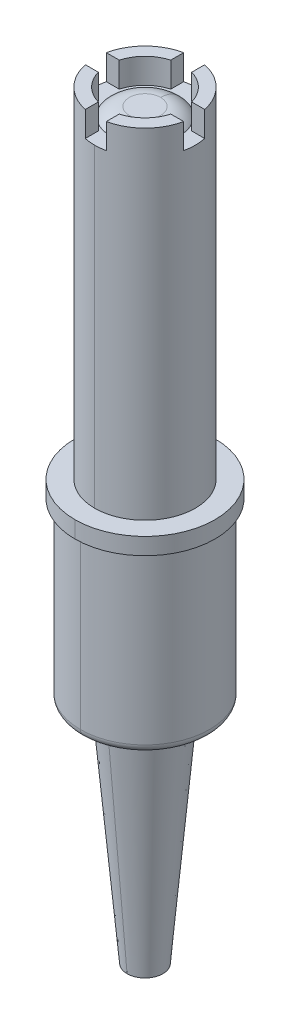
ISO-10303-21;
HEADER;
FILE_DESCRIPTION(('STEP AP214'),'2;1');
FILE_NAME('part.step','',(''),(''),'','','');
FILE_SCHEMA(('AUTOMOTIVE_DESIGN { 1 0 10303 214 1 1 1 1 }'));
ENDSEC;
DATA;
#1=APPLICATION_CONTEXT('core data for automotive mechanical design processes');
#2=APPLICATION_PROTOCOL_DEFINITION('international standard','automotive_design',2000,#1);
#3=PRODUCT_CONTEXT('',#1,'mechanical');
#4=PRODUCT('Part','Part','',(#3));
#5=PRODUCT_RELATED_PRODUCT_CATEGORY('part','',(#4));
#6=PRODUCT_DEFINITION_FORMATION('','',#4);
#7=PRODUCT_DEFINITION_CONTEXT('part definition',#1,'design');
#8=PRODUCT_DEFINITION('design','',#6,#7);
#9=PRODUCT_DEFINITION_SHAPE('','',#8);
#10=(LENGTH_UNIT() NAMED_UNIT(*) SI_UNIT(.MILLI.,.METRE.));
#11=(NAMED_UNIT(*) PLANE_ANGLE_UNIT() SI_UNIT($,.RADIAN.));
#12=(NAMED_UNIT(*) SI_UNIT($,.STERADIAN.) SOLID_ANGLE_UNIT());
#13=UNCERTAINTY_MEASURE_WITH_UNIT(LENGTH_MEASURE(1.E-05),#10,'distance_accuracy_value','');
#14=(GEOMETRIC_REPRESENTATION_CONTEXT(3) GLOBAL_UNCERTAINTY_ASSIGNED_CONTEXT((#13)) GLOBAL_UNIT_ASSIGNED_CONTEXT((#10,
#11,#12)) REPRESENTATION_CONTEXT('',''));
#15=CARTESIAN_POINT('',(0.,0.,0.));
#16=DIRECTION('',(0.,0.,1.));
#17=DIRECTION('',(1.,0.,0.));
#18=AXIS2_PLACEMENT_3D('',#15,#16,#17);
#19=CARTESIAN_POINT('',(0.,-27.,0.));
#20=DIRECTION('',(0.,-1.,0.));
#21=DIRECTION('',(0.,0.,-1.));
#22=AXIS2_PLACEMENT_3D('',#19,#20,#21);
#23=PLANE('',#22);
#24=CARTESIAN_POINT('',(0.,-27.,0.));
#25=DIRECTION('',(0.,-1.,0.));
#26=DIRECTION('',(0.,0.,-1.));
#27=AXIS2_PLACEMENT_3D('',#24,#25,#26);
#28=CIRCLE('',#27,2.13780608480005);
#29=CARTESIAN_POINT('',(0.,-27.,-2.13780608480005));
#30=VERTEX_POINT('',#29);
#31=CARTESIAN_POINT('',(0.,-27.,2.13780608480005));
#32=VERTEX_POINT('',#31);
#33=EDGE_CURVE('E11',#30,#32,#28,.T.);
#34=ORIENTED_EDGE('',*,*,#33,.T.);
#35=CARTESIAN_POINT('',(0.,-27.,0.));
#36=DIRECTION('',(0.,-1.,0.));
#37=DIRECTION('',(0.,0.,-1.));
#38=AXIS2_PLACEMENT_3D('',#35,#36,#37);
#39=CIRCLE('',#38,2.13780608480005);
#40=EDGE_CURVE('E428',#32,#30,#39,.T.);
#41=ORIENTED_EDGE('',*,*,#40,.T.);
#42=EDGE_LOOP('',(#34,#41));
#43=FACE_BOUND('',#42,.T.);
#44=ADVANCED_FACE('F60',(#43),#23,.T.);
#45=CARTESIAN_POINT('',(0.,0.,0.));
#46=DIRECTION('',(0.,1.,0.));
#47=DIRECTION('',(0.,0.,-1.));
#48=AXIS2_PLACEMENT_3D('',#45,#46,#47);
#49=CONICAL_SURFACE('',#48,4.5,0.0872664625997163);
#50=DIRECTION('',(0.,0.996194698091746,0.0871557427476582));
#51=VECTOR('',#50,1.);
#52=CARTESIAN_POINT('',(0.,0.,4.5));
#53=LINE('',#52,#51);
#54=CARTESIAN_POINT('',(0.,0.,4.5));
#55=VERTEX_POINT('',#54);
#56=EDGE_CURVE('E423',#32,#55,#53,.T.);
#57=ORIENTED_EDGE('',*,*,#56,.F.);
#58=ORIENTED_EDGE('',*,*,#33,.F.);
#59=DIRECTION('',(0.,0.996194698091746,-0.0871557427476582));
#60=VECTOR('',#59,1.);
#61=CARTESIAN_POINT('',(0.,0.,-4.5));
#62=LINE('',#61,#60);
#63=CARTESIAN_POINT('',(0.,0.,-4.5));
#64=VERTEX_POINT('',#63);
#65=EDGE_CURVE('E494',#30,#64,#62,.T.);
#66=ORIENTED_EDGE('',*,*,#65,.T.);
#67=CARTESIAN_POINT('',(0.,0.,0.));
#68=DIRECTION('',(0.,-1.,0.));
#69=DIRECTION('',(0.,0.,1.));
#70=AXIS2_PLACEMENT_3D('',#67,#68,#69);
#71=CIRCLE('',#70,4.5);
#72=EDGE_CURVE('E368',#64,#55,#71,.T.);
#73=ORIENTED_EDGE('',*,*,#72,.T.);
#74=EDGE_LOOP('',(#57,#58,#66,#73));
#75=FACE_BOUND('',#74,.T.);
#76=ADVANCED_FACE('F823',(#75),#49,.T.);
#77=CARTESIAN_POINT('',(0.,58.5,0.));
#78=DIRECTION('',(0.,-1.,0.));
#79=DIRECTION('',(0.,0.,-1.));
#80=AXIS2_PLACEMENT_3D('',#77,#78,#79);
#81=DEGENERATE_TOROIDAL_SURFACE('',#80,1.86393202250021,3.,.T.);
#82=CARTESIAN_POINT('',(0.,58.5,1.86393202250021));
#83=DIRECTION('',(1.,0.,0.));
#84=DIRECTION('',(0.,0.,-1.));
#85=AXIS2_PLACEMENT_3D('',#82,#83,#84);
#86=CIRCLE('',#85,3.);
#87=CARTESIAN_POINT('',(0.,61.5,1.86393202250021));
#88=VERTEX_POINT('',#87);
#89=CARTESIAN_POINT('',(0.,60.5,4.1));
#90=VERTEX_POINT('',#89);
#91=EDGE_CURVE('E487',#88,#90,#86,.T.);
#92=ORIENTED_EDGE('',*,*,#91,.F.);
#93=CARTESIAN_POINT('',(0.,61.5,0.));
#94=DIRECTION('',(0.,1.,0.));
#95=DIRECTION('',(0.,0.,1.));
#96=AXIS2_PLACEMENT_3D('',#93,#94,#95);
#97=CIRCLE('',#96,1.86393202250021);
#98=CARTESIAN_POINT('',(0.,61.5,-1.86393202250021));
#99=VERTEX_POINT('',#98);
#100=EDGE_CURVE('E71',#99,#88,#97,.T.);
#101=ORIENTED_EDGE('',*,*,#100,.F.);
#102=CARTESIAN_POINT('',(0.,58.5,-1.86393202250021));
#103=DIRECTION('',(-1.,0.,0.));
#104=DIRECTION('',(0.,0.,1.));
#105=AXIS2_PLACEMENT_3D('',#102,#103,#104);
#106=CIRCLE('',#105,3.);
#107=CARTESIAN_POINT('',(0.,60.5,-4.1));
#108=VERTEX_POINT('',#107);
#109=EDGE_CURVE('E417',#99,#108,#106,.T.);
#110=ORIENTED_EDGE('',*,*,#109,.T.);
#111=CARTESIAN_POINT('',(0.,60.5,0.));
#112=DIRECTION('',(0.,1.,0.));
#113=DIRECTION('',(0.,0.,1.));
#114=AXIS2_PLACEMENT_3D('',#111,#112,#113);
#115=CIRCLE('',#114,4.1);
#116=EDGE_CURVE('E541',#108,#90,#115,.T.);
#117=ORIENTED_EDGE('',*,*,#116,.T.);
#118=EDGE_LOOP('',(#92,#101,#110,#117));
#119=FACE_BOUND('',#118,.T.);
#120=ADVANCED_FACE('F62',(#119),#81,.T.);
#121=CARTESIAN_POINT('',(0.,61.5,0.));
#122=DIRECTION('',(0.,1.,0.));
#123=DIRECTION('',(1.,0.,0.));
#124=AXIS2_PLACEMENT_3D('',#121,#122,#123);
#125=PLANE('',#124);
#126=ORIENTED_EDGE('',*,*,#100,.T.);
#127=CARTESIAN_POINT('',(0.,61.5,0.));
#128=DIRECTION('',(0.,1.,0.));
#129=DIRECTION('',(0.,0.,1.));
#130=AXIS2_PLACEMENT_3D('',#127,#128,#129);
#131=CIRCLE('',#130,1.86393202250021);
#132=EDGE_CURVE('E339',#88,#99,#131,.T.);
#133=ORIENTED_EDGE('',*,*,#132,.T.);
#134=EDGE_LOOP('',(#126,#133));
#135=FACE_BOUND('',#134,.T.);
#136=ADVANCED_FACE('F839',(#135),#125,.T.);
#137=CARTESIAN_POINT('',(0.,60.5,1.25));
#138=DIRECTION('',(0.,0.,1.));
#139=DIRECTION('',(1.,0.,0.));
#140=AXIS2_PLACEMENT_3D('',#137,#138,#139);
#141=PLANE('',#140);
#142=DIRECTION('',(1.,0.,0.));
#143=VECTOR('',#142,1.);
#144=CARTESIAN_POINT('',(0.,63.5,1.25));
#145=LINE('',#144,#143);
#146=CARTESIAN_POINT('',(4.32290411644765,63.5,1.25));
#147=VERTEX_POINT('',#146);
#148=CARTESIAN_POINT('',(5.86834729715275,63.5,1.25));
#149=VERTEX_POINT('',#148);
#150=EDGE_CURVE('E354',#147,#149,#145,.T.);
#151=ORIENTED_EDGE('',*,*,#150,.T.);
#152=DIRECTION('',(0.,1.,0.));
#153=VECTOR('',#152,1.);
#154=CARTESIAN_POINT('',(5.86834729715275,60.5,1.25));
#155=LINE('',#154,#153);
#156=CARTESIAN_POINT('',(5.86834729715275,60.5,1.25));
#157=VERTEX_POINT('',#156);
#158=EDGE_CURVE('E388',#157,#149,#155,.T.);
#159=ORIENTED_EDGE('',*,*,#158,.F.);
#160=DIRECTION('',(1.,0.,0.));
#161=VECTOR('',#160,1.);
#162=CARTESIAN_POINT('',(0.,60.5,1.25));
#163=LINE('',#162,#161);
#164=CARTESIAN_POINT('',(4.32290411644765,60.5,1.25));
#165=VERTEX_POINT('',#164);
#166=EDGE_CURVE('E364',#165,#157,#163,.T.);
#167=ORIENTED_EDGE('',*,*,#166,.F.);
#168=DIRECTION('',(0.,1.,0.));
#169=VECTOR('',#168,1.);
#170=CARTESIAN_POINT('',(4.32290411644765,60.5,1.25));
#171=LINE('',#170,#169);
#172=EDGE_CURVE('E411',#165,#147,#171,.T.);
#173=ORIENTED_EDGE('',*,*,#172,.T.);
#174=EDGE_LOOP('',(#151,#159,#167,#173));
#175=FACE_BOUND('',#174,.T.);
#176=ADVANCED_FACE('F1191',(#175),#141,.F.);
#177=CARTESIAN_POINT('',(0.,60.5,-1.25));
#178=DIRECTION('',(0.,0.,1.));
#179=DIRECTION('',(1.,0.,0.));
#180=AXIS2_PLACEMENT_3D('',#177,#178,#179);
#181=PLANE('',#180);
#182=DIRECTION('',(1.,0.,0.));
#183=VECTOR('',#182,1.);
#184=CARTESIAN_POINT('',(0.,63.5,-1.25));
#185=LINE('',#184,#183);
#186=CARTESIAN_POINT('',(4.32290411644765,63.5,-1.25));
#187=VERTEX_POINT('',#186);
#188=CARTESIAN_POINT('',(5.86834729715275,63.5,-1.25));
#189=VERTEX_POINT('',#188);
#190=EDGE_CURVE('E393',#187,#189,#185,.T.);
#191=ORIENTED_EDGE('',*,*,#190,.F.);
#192=DIRECTION('',(0.,1.,0.));
#193=VECTOR('',#192,1.);
#194=CARTESIAN_POINT('',(4.32290411644765,60.5,-1.25));
#195=LINE('',#194,#193);
#196=CARTESIAN_POINT('',(4.32290411644765,60.5,-1.25));
#197=VERTEX_POINT('',#196);
#198=EDGE_CURVE('E399',#197,#187,#195,.T.);
#199=ORIENTED_EDGE('',*,*,#198,.F.);
#200=DIRECTION('',(1.,0.,0.));
#201=VECTOR('',#200,1.);
#202=CARTESIAN_POINT('',(0.,60.5,-1.25));
#203=LINE('',#202,#201);
#204=CARTESIAN_POINT('',(5.86834729715275,60.5,-1.25));
#205=VERTEX_POINT('',#204);
#206=EDGE_CURVE('E367',#197,#205,#203,.T.);
#207=ORIENTED_EDGE('',*,*,#206,.T.);
#208=DIRECTION('',(0.,1.,0.));
#209=VECTOR('',#208,1.);
#210=CARTESIAN_POINT('',(5.86834729715275,60.5,-1.25));
#211=LINE('',#210,#209);
#212=EDGE_CURVE('E530',#205,#189,#211,.T.);
#213=ORIENTED_EDGE('',*,*,#212,.T.);
#214=EDGE_LOOP('',(#191,#199,#207,#213));
#215=FACE_BOUND('',#214,.T.);
#216=ADVANCED_FACE('F1217',(#215),#181,.T.);
#217=CARTESIAN_POINT('',(1.25,60.5,0.));
#218=DIRECTION('',(1.,0.,0.));
#219=DIRECTION('',(0.,1.,0.));
#220=AXIS2_PLACEMENT_3D('',#217,#218,#219);
#221=PLANE('',#220);
#222=DIRECTION('',(0.,0.,-1.));
#223=VECTOR('',#222,1.);
#224=CARTESIAN_POINT('',(1.25,63.5,0.));
#225=LINE('',#224,#223);
#226=CARTESIAN_POINT('',(1.25,63.5,5.86834729715275));
#227=VERTEX_POINT('',#226);
#228=CARTESIAN_POINT('',(1.25,63.5,4.32290411644765));
#229=VERTEX_POINT('',#228);
#230=EDGE_CURVE('E403',#227,#229,#225,.T.);
#231=ORIENTED_EDGE('',*,*,#230,.T.);
#232=DIRECTION('',(0.,1.,0.));
#233=VECTOR('',#232,1.);
#234=CARTESIAN_POINT('',(1.25,60.5,4.32290411644765));
#235=LINE('',#234,#233);
#236=CARTESIAN_POINT('',(1.25,60.5,4.32290411644765));
#237=VERTEX_POINT('',#236);
#238=EDGE_CURVE('E422',#237,#229,#235,.T.);
#239=ORIENTED_EDGE('',*,*,#238,.F.);
#240=DIRECTION('',(0.,0.,-1.));
#241=VECTOR('',#240,1.);
#242=CARTESIAN_POINT('',(1.25,60.5,0.));
#243=LINE('',#242,#241);
#244=CARTESIAN_POINT('',(1.25,60.5,5.86834729715275));
#245=VERTEX_POINT('',#244);
#246=EDGE_CURVE('E85',#245,#237,#243,.T.);
#247=ORIENTED_EDGE('',*,*,#246,.F.);
#248=DIRECTION('',(0.,1.,0.));
#249=VECTOR('',#248,1.);
#250=CARTESIAN_POINT('',(1.25,60.5,5.86834729715275));
#251=LINE('',#250,#249);
#252=EDGE_CURVE('E342',#245,#227,#251,.T.);
#253=ORIENTED_EDGE('',*,*,#252,.T.);
#254=EDGE_LOOP('',(#231,#239,#247,#253));
#255=FACE_BOUND('',#254,.T.);
#256=ADVANCED_FACE('F1211',(#255),#221,.F.);
#257=CARTESIAN_POINT('',(-1.25,60.5,0.));
#258=DIRECTION('',(1.,0.,0.));
#259=DIRECTION('',(0.,0.,-1.));
#260=AXIS2_PLACEMENT_3D('',#257,#258,#259);
#261=PLANE('',#260);
#262=DIRECTION('',(0.,0.,-1.));
#263=VECTOR('',#262,1.);
#264=CARTESIAN_POINT('',(-1.25,63.5,0.));
#265=LINE('',#264,#263);
#266=CARTESIAN_POINT('',(-1.25,63.5,5.86834729715275));
#267=VERTEX_POINT('',#266);
#268=CARTESIAN_POINT('',(-1.25,63.5,4.32290411644765));
#269=VERTEX_POINT('',#268);
#270=EDGE_CURVE('E287',#267,#269,#265,.T.);
#271=ORIENTED_EDGE('',*,*,#270,.F.);
#272=DIRECTION('',(0.,1.,0.));
#273=VECTOR('',#272,1.);
#274=CARTESIAN_POINT('',(-1.25,60.5,5.86834729715275));
#275=LINE('',#274,#273);
#276=CARTESIAN_POINT('',(-1.25,60.5,5.86834729715275));
#277=VERTEX_POINT('',#276);
#278=EDGE_CURVE('E348',#277,#267,#275,.T.);
#279=ORIENTED_EDGE('',*,*,#278,.F.);
#280=DIRECTION('',(0.,0.,-1.));
#281=VECTOR('',#280,1.);
#282=CARTESIAN_POINT('',(-1.25,60.5,0.));
#283=LINE('',#282,#281);
#284=CARTESIAN_POINT('',(-1.25,60.5,4.32290411644765));
#285=VERTEX_POINT('',#284);
#286=EDGE_CURVE('E438',#277,#285,#283,.T.);
#287=ORIENTED_EDGE('',*,*,#286,.T.);
#288=DIRECTION('',(0.,1.,0.));
#289=VECTOR('',#288,1.);
#290=CARTESIAN_POINT('',(-1.25,60.5,4.32290411644765));
#291=LINE('',#290,#289);
#292=EDGE_CURVE('E451',#285,#269,#291,.T.);
#293=ORIENTED_EDGE('',*,*,#292,.T.);
#294=EDGE_LOOP('',(#271,#279,#287,#293));
#295=FACE_BOUND('',#294,.T.);
#296=ADVANCED_FACE('F1216',(#295),#261,.T.);
#297=CARTESIAN_POINT('',(-0.0055784842625831,60.5,1.26897914026433));
#298=DIRECTION('',(-0.00439599847134383,0.,0.999990337552038));
#299=DIRECTION('',(0.,1.,0.));
#300=AXIS2_PLACEMENT_3D('',#297,#298,#299);
#301=PLANE('',#300);
#302=DIRECTION('',(0.999990337552039,0.,0.00439599847134383));
#303=VECTOR('',#302,1.);
#304=CARTESIAN_POINT('',(-0.0055784842625831,63.5,1.26897914026433));
#305=LINE('',#304,#303);
#306=CARTESIAN_POINT('',(-5.86979166666667,63.5,1.2431998189875));
#307=VERTEX_POINT('',#306);
#308=CARTESIAN_POINT('',(-4.32290411644765,63.5,1.25));
#309=VERTEX_POINT('',#308);
#310=EDGE_CURVE('E275',#307,#309,#305,.T.);
#311=ORIENTED_EDGE('',*,*,#310,.T.);
#312=DIRECTION('',(0.,1.,0.));
#313=VECTOR('',#312,1.);
#314=CARTESIAN_POINT('',(-4.32290411644765,60.5,1.25));
#315=LINE('',#314,#313);
#316=CARTESIAN_POINT('',(-4.32290411644765,60.5,1.25));
#317=VERTEX_POINT('',#316);
#318=EDGE_CURVE('E450',#317,#309,#315,.T.);
#319=ORIENTED_EDGE('',*,*,#318,.F.);
#320=DIRECTION('',(0.999990337552039,0.,0.00439599847134383));
#321=VECTOR('',#320,1.);
#322=CARTESIAN_POINT('',(-0.0055784842625831,60.5,1.26897914026433));
#323=LINE('',#322,#321);
#324=CARTESIAN_POINT('',(-5.86979166666667,60.5,1.2431998189875));
#325=VERTEX_POINT('',#324);
#326=EDGE_CURVE('E206',#325,#317,#323,.T.);
#327=ORIENTED_EDGE('',*,*,#326,.F.);
#328=DIRECTION('',(0.,1.,0.));
#329=VECTOR('',#328,1.);
#330=CARTESIAN_POINT('',(-5.86979166666667,60.5,1.2431998189875));
#331=LINE('',#330,#329);
#332=EDGE_CURVE('E384',#325,#307,#331,.T.);
#333=ORIENTED_EDGE('',*,*,#332,.T.);
#334=EDGE_LOOP('',(#311,#319,#327,#333));
#335=FACE_BOUND('',#334,.T.);
#336=ADVANCED_FACE('F1293',(#335),#301,.F.);
#337=CARTESIAN_POINT('',(0.,60.5,-1.25));
#338=DIRECTION('',(0.,0.,1.));
#339=DIRECTION('',(1.,0.,0.));
#340=AXIS2_PLACEMENT_3D('',#337,#338,#339);
#341=PLANE('',#340);
#342=DIRECTION('',(1.,0.,0.));
#343=VECTOR('',#342,1.);
#344=CARTESIAN_POINT('',(0.,63.5,-1.25));
#345=LINE('',#344,#343);
#346=CARTESIAN_POINT('',(-5.86834729715275,63.5,-1.25));
#347=VERTEX_POINT('',#346);
#348=CARTESIAN_POINT('',(-4.32290411644765,63.5,-1.25));
#349=VERTEX_POINT('',#348);
#350=EDGE_CURVE('E398',#347,#349,#345,.T.);
#351=ORIENTED_EDGE('',*,*,#350,.F.);
#352=DIRECTION('',(0.,1.,0.));
#353=VECTOR('',#352,1.);
#354=CARTESIAN_POINT('',(-5.86834729715275,60.5,-1.25));
#355=LINE('',#354,#353);
#356=CARTESIAN_POINT('',(-5.86834729715275,60.5,-1.25));
#357=VERTEX_POINT('',#356);
#358=EDGE_CURVE('E501',#357,#347,#355,.T.);
#359=ORIENTED_EDGE('',*,*,#358,.F.);
#360=DIRECTION('',(1.,0.,0.));
#361=VECTOR('',#360,1.);
#362=CARTESIAN_POINT('',(0.,60.5,-1.25));
#363=LINE('',#362,#361);
#364=CARTESIAN_POINT('',(-4.32290411644765,60.5,-1.25));
#365=VERTEX_POINT('',#364);
#366=EDGE_CURVE('E194',#357,#365,#363,.T.);
#367=ORIENTED_EDGE('',*,*,#366,.T.);
#368=DIRECTION('',(0.,1.,0.));
#369=VECTOR('',#368,1.);
#370=CARTESIAN_POINT('',(-4.32290411644765,60.5,-1.25));
#371=LINE('',#370,#369);
#372=EDGE_CURVE('E408',#365,#349,#371,.T.);
#373=ORIENTED_EDGE('',*,*,#372,.T.);
#374=EDGE_LOOP('',(#351,#359,#367,#373));
#375=FACE_BOUND('',#374,.T.);
#376=ADVANCED_FACE('F1273',(#375),#341,.T.);
#377=CARTESIAN_POINT('',(1.25,60.5,0.));
#378=DIRECTION('',(1.,0.,0.));
#379=DIRECTION('',(0.,0.,-1.));
#380=AXIS2_PLACEMENT_3D('',#377,#378,#379);
#381=PLANE('',#380);
#382=DIRECTION('',(0.,0.,-1.));
#383=VECTOR('',#382,1.);
#384=CARTESIAN_POINT('',(1.25,63.5,0.));
#385=LINE('',#384,#383);
#386=CARTESIAN_POINT('',(1.25,63.5,-4.32290411644765));
#387=VERTEX_POINT('',#386);
#388=CARTESIAN_POINT('',(1.25,63.5,-5.86834729715275));
#389=VERTEX_POINT('',#388);
#390=EDGE_CURVE('E485',#387,#389,#385,.T.);
#391=ORIENTED_EDGE('',*,*,#390,.T.);
#392=DIRECTION('',(0.,1.,0.));
#393=VECTOR('',#392,1.);
#394=CARTESIAN_POINT('',(1.25,60.5,-5.86834729715275));
#395=LINE('',#394,#393);
#396=CARTESIAN_POINT('',(1.25,60.5,-5.86834729715275));
#397=VERTEX_POINT('',#396);
#398=EDGE_CURVE('E376',#397,#389,#395,.T.);
#399=ORIENTED_EDGE('',*,*,#398,.F.);
#400=DIRECTION('',(0.,0.,-1.));
#401=VECTOR('',#400,1.);
#402=CARTESIAN_POINT('',(1.25,60.5,0.));
#403=LINE('',#402,#401);
#404=CARTESIAN_POINT('',(1.25,60.5,-4.32290411644765));
#405=VERTEX_POINT('',#404);
#406=EDGE_CURVE('E369',#405,#397,#403,.T.);
#407=ORIENTED_EDGE('',*,*,#406,.F.);
#408=DIRECTION('',(0.,1.,0.));
#409=VECTOR('',#408,1.);
#410=CARTESIAN_POINT('',(1.25,60.5,-4.32290411644765));
#411=LINE('',#410,#409);
#412=EDGE_CURVE('E402',#405,#387,#411,.T.);
#413=ORIENTED_EDGE('',*,*,#412,.T.);
#414=EDGE_LOOP('',(#391,#399,#407,#413));
#415=FACE_BOUND('',#414,.T.);
#416=ADVANCED_FACE('F1155',(#415),#381,.F.);
#417=CARTESIAN_POINT('',(-1.25,60.5,0.));
#418=DIRECTION('',(1.,0.,0.));
#419=DIRECTION('',(0.,1.,0.));
#420=AXIS2_PLACEMENT_3D('',#417,#418,#419);
#421=PLANE('',#420);
#422=DIRECTION('',(0.,0.,-1.));
#423=VECTOR('',#422,1.);
#424=CARTESIAN_POINT('',(-1.25,63.5,0.));
#425=LINE('',#424,#423);
#426=CARTESIAN_POINT('',(-1.25,63.5,-4.32290411644765));
#427=VERTEX_POINT('',#426);
#428=CARTESIAN_POINT('',(-1.25,63.5,-5.86834729715275));
#429=VERTEX_POINT('',#428);
#430=EDGE_CURVE('E359',#427,#429,#425,.T.);
#431=ORIENTED_EDGE('',*,*,#430,.F.);
#432=DIRECTION('',(0.,1.,0.));
#433=VECTOR('',#432,1.);
#434=CARTESIAN_POINT('',(-1.25,60.5,-4.32290411644765));
#435=LINE('',#434,#433);
#436=CARTESIAN_POINT('',(-1.25,60.5,-4.32290411644765));
#437=VERTEX_POINT('',#436);
#438=EDGE_CURVE('E407',#437,#427,#435,.T.);
#439=ORIENTED_EDGE('',*,*,#438,.F.);
#440=DIRECTION('',(0.,0.,-1.));
#441=VECTOR('',#440,1.);
#442=CARTESIAN_POINT('',(-1.25,60.5,0.));
#443=LINE('',#442,#441);
#444=CARTESIAN_POINT('',(-1.25,60.5,-5.86834729715275));
#445=VERTEX_POINT('',#444);
#446=EDGE_CURVE('E184',#437,#445,#443,.T.);
#447=ORIENTED_EDGE('',*,*,#446,.T.);
#448=DIRECTION('',(0.,1.,0.));
#449=VECTOR('',#448,1.);
#450=CARTESIAN_POINT('',(-1.25,60.5,-5.86834729715275));
#451=LINE('',#450,#449);
#452=EDGE_CURVE('E534',#445,#429,#451,.T.);
#453=ORIENTED_EDGE('',*,*,#452,.T.);
#454=EDGE_LOOP('',(#431,#439,#447,#453));
#455=FACE_BOUND('',#454,.T.);
#456=ADVANCED_FACE('F1132',(#455),#421,.T.);
#457=CARTESIAN_POINT('',(0.,60.5,0.));
#458=DIRECTION('',(0.,1.,0.));
#459=DIRECTION('',(1.,0.,0.));
#460=AXIS2_PLACEMENT_3D('',#457,#458,#459);
#461=PLANE('',#460);
#462=ORIENTED_EDGE('',*,*,#116,.F.);
#463=CARTESIAN_POINT('',(0.,60.5,0.));
#464=DIRECTION('',(0.,1.,0.));
#465=DIRECTION('',(0.,0.,1.));
#466=AXIS2_PLACEMENT_3D('',#463,#464,#465);
#467=CIRCLE('',#466,4.1);
#468=EDGE_CURVE('E491',#90,#108,#467,.T.);
#469=ORIENTED_EDGE('',*,*,#468,.F.);
#470=EDGE_LOOP('',(#462,#469));
#471=FACE_BOUND('',#470,.T.);
#472=CARTESIAN_POINT('',(0.,60.5,0.));
#473=DIRECTION('',(0.,1.,0.));
#474=DIRECTION('',(0.,0.,1.));
#475=AXIS2_PLACEMENT_3D('',#472,#473,#474);
#476=CIRCLE('',#475,4.5);
#477=EDGE_CURVE('E582',#237,#165,#476,.T.);
#478=ORIENTED_EDGE('',*,*,#477,.T.);
#479=ORIENTED_EDGE('',*,*,#166,.T.);
#480=CARTESIAN_POINT('',(0.,60.5,0.));
#481=DIRECTION('',(0.,1.,0.));
#482=DIRECTION('',(0.,0.,1.));
#483=AXIS2_PLACEMENT_3D('',#480,#481,#482);
#484=CIRCLE('',#483,6.);
#485=EDGE_CURVE('E513',#157,#205,#484,.T.);
#486=ORIENTED_EDGE('',*,*,#485,.T.);
#487=ORIENTED_EDGE('',*,*,#206,.F.);
#488=CARTESIAN_POINT('',(0.,60.5,0.));
#489=DIRECTION('',(0.,1.,0.));
#490=DIRECTION('',(0.,0.,1.));
#491=AXIS2_PLACEMENT_3D('',#488,#489,#490);
#492=CIRCLE('',#491,4.5);
#493=EDGE_CURVE('E460',#197,#405,#492,.T.);
#494=ORIENTED_EDGE('',*,*,#493,.T.);
#495=ORIENTED_EDGE('',*,*,#406,.T.);
#496=CARTESIAN_POINT('',(0.,60.5,0.));
#497=DIRECTION('',(0.,1.,0.));
#498=DIRECTION('',(0.,0.,1.));
#499=AXIS2_PLACEMENT_3D('',#496,#497,#498);
#500=CIRCLE('',#499,6.);
#501=CARTESIAN_POINT('',(0.,60.5,-6.));
#502=VERTEX_POINT('',#501);
#503=EDGE_CURVE('E381',#397,#502,#500,.T.);
#504=ORIENTED_EDGE('',*,*,#503,.T.);
#505=CARTESIAN_POINT('',(0.,60.5,0.));
#506=DIRECTION('',(0.,1.,0.));
#507=DIRECTION('',(0.,0.,1.));
#508=AXIS2_PLACEMENT_3D('',#505,#506,#507);
#509=CIRCLE('',#508,6.);
#510=EDGE_CURVE('E64',#502,#445,#509,.T.);
#511=ORIENTED_EDGE('',*,*,#510,.T.);
#512=ORIENTED_EDGE('',*,*,#446,.F.);
#513=CARTESIAN_POINT('',(0.,60.5,0.));
#514=DIRECTION('',(0.,1.,0.));
#515=DIRECTION('',(0.,0.,1.));
#516=AXIS2_PLACEMENT_3D('',#513,#514,#515);
#517=CIRCLE('',#516,4.5);
#518=EDGE_CURVE('E404',#437,#365,#517,.T.);
#519=ORIENTED_EDGE('',*,*,#518,.T.);
#520=ORIENTED_EDGE('',*,*,#366,.F.);
#521=CARTESIAN_POINT('',(0.,60.5,0.));
#522=DIRECTION('',(0.,1.,0.));
#523=DIRECTION('',(0.,0.,1.));
#524=AXIS2_PLACEMENT_3D('',#521,#522,#523);
#525=CIRCLE('',#524,6.);
#526=EDGE_CURVE('E498',#357,#325,#525,.T.);
#527=ORIENTED_EDGE('',*,*,#526,.T.);
#528=ORIENTED_EDGE('',*,*,#326,.T.);
#529=CARTESIAN_POINT('',(0.,60.5,0.));
#530=DIRECTION('',(0.,1.,0.));
#531=DIRECTION('',(0.,0.,1.));
#532=AXIS2_PLACEMENT_3D('',#529,#530,#531);
#533=CIRCLE('',#532,4.5);
#534=EDGE_CURVE('E447',#317,#285,#533,.T.);
#535=ORIENTED_EDGE('',*,*,#534,.T.);
#536=ORIENTED_EDGE('',*,*,#286,.F.);
#537=CARTESIAN_POINT('',(0.,60.5,0.));
#538=DIRECTION('',(0.,1.,0.));
#539=DIRECTION('',(0.,0.,1.));
#540=AXIS2_PLACEMENT_3D('',#537,#538,#539);
#541=CIRCLE('',#540,6.);
#542=CARTESIAN_POINT('',(0.,60.5,6.));
#543=VERTEX_POINT('',#542);
#544=EDGE_CURVE('E353',#277,#543,#541,.T.);
#545=ORIENTED_EDGE('',*,*,#544,.T.);
#546=CARTESIAN_POINT('',(0.,60.5,0.));
#547=DIRECTION('',(0.,1.,0.));
#548=DIRECTION('',(0.,0.,1.));
#549=AXIS2_PLACEMENT_3D('',#546,#547,#548);
#550=CIRCLE('',#549,6.);
#551=EDGE_CURVE('E346',#543,#245,#550,.T.);
#552=ORIENTED_EDGE('',*,*,#551,.T.);
#553=ORIENTED_EDGE('',*,*,#246,.T.);
#554=EDGE_LOOP('',(#478,#479,#486,#487,#494,#495,#504,#511,#512,#519,#520,#527,#528,#535,#536,
#545,#552,#553));
#555=FACE_BOUND('',#554,.T.);
#556=ADVANCED_FACE('F595',(#471,#555),#461,.T.);
#557=CARTESIAN_POINT('',(0.,1.,0.));
#558=DIRECTION('',(0.,1.,0.));
#559=DIRECTION('',(0.,0.,1.));
#560=AXIS2_PLACEMENT_3D('',#557,#558,#559);
#561=TOROIDAL_SURFACE('',#560,6.7,1.);
#562=CARTESIAN_POINT('',(0.,1.,-6.7));
#563=DIRECTION('',(1.,0.,0.));
#564=DIRECTION('',(0.,0.,-1.));
#565=AXIS2_PLACEMENT_3D('',#562,#563,#564);
#566=CIRCLE('',#565,1.);
#567=CARTESIAN_POINT('',(0.,0.,-6.7));
#568=VERTEX_POINT('',#567);
#569=CARTESIAN_POINT('',(0.,1.,-7.7));
#570=VERTEX_POINT('',#569);
#571=EDGE_CURVE('E416',#568,#570,#566,.T.);
#572=ORIENTED_EDGE('',*,*,#571,.F.);
#573=CARTESIAN_POINT('',(0.,0.,0.));
#574=DIRECTION('',(0.,-1.,0.));
#575=DIRECTION('',(0.,0.,1.));
#576=AXIS2_PLACEMENT_3D('',#573,#574,#575);
#577=CIRCLE('',#576,6.7);
#578=CARTESIAN_POINT('',(0.,0.,6.7));
#579=VERTEX_POINT('',#578);
#580=EDGE_CURVE('E363',#579,#568,#577,.T.);
#581=ORIENTED_EDGE('',*,*,#580,.F.);
#582=CARTESIAN_POINT('',(0.,1.,6.7));
#583=DIRECTION('',(-1.,0.,0.));
#584=DIRECTION('',(0.,0.,1.));
#585=AXIS2_PLACEMENT_3D('',#582,#583,#584);
#586=CIRCLE('',#585,1.);
#587=CARTESIAN_POINT('',(0.,1.,7.7));
#588=VERTEX_POINT('',#587);
#589=EDGE_CURVE('E441',#579,#588,#586,.T.);
#590=ORIENTED_EDGE('',*,*,#589,.T.);
#591=CARTESIAN_POINT('',(0.,1.,0.));
#592=DIRECTION('',(0.,1.,0.));
#593=DIRECTION('',(0.,0.,1.));
#594=AXIS2_PLACEMENT_3D('',#591,#592,#593);
#595=CIRCLE('',#594,7.7);
#596=EDGE_CURVE('E360',#570,#588,#595,.T.);
#597=ORIENTED_EDGE('',*,*,#596,.F.);
#598=EDGE_LOOP('',(#572,#581,#590,#597));
#599=FACE_BOUND('',#598,.T.);
#600=ADVANCED_FACE('F1131',(#599),#561,.T.);
#601=CARTESIAN_POINT('',(0.,0.,0.));
#602=DIRECTION('',(0.,1.,0.));
#603=DIRECTION('',(1.,0.,0.));
#604=AXIS2_PLACEMENT_3D('',#601,#602,#603);
#605=PLANE('',#604);
#606=ORIENTED_EDGE('',*,*,#72,.F.);
#607=CARTESIAN_POINT('',(0.,0.,0.));
#608=DIRECTION('',(0.,-1.,0.));
#609=DIRECTION('',(0.,0.,1.));
#610=AXIS2_PLACEMENT_3D('',#607,#608,#609);
#611=CIRCLE('',#610,4.5);
#612=EDGE_CURVE('E427',#55,#64,#611,.T.);
#613=ORIENTED_EDGE('',*,*,#612,.F.);
#614=EDGE_LOOP('',(#606,#613));
#615=FACE_BOUND('',#614,.T.);
#616=ORIENTED_EDGE('',*,*,#580,.T.);
#617=CARTESIAN_POINT('',(0.,0.,0.));
#618=DIRECTION('',(0.,-1.,0.));
#619=DIRECTION('',(0.,0.,1.));
#620=AXIS2_PLACEMENT_3D('',#617,#618,#619);
#621=CIRCLE('',#620,6.7);
#622=EDGE_CURVE('E412',#568,#579,#621,.T.);
#623=ORIENTED_EDGE('',*,*,#622,.T.);
#624=EDGE_LOOP('',(#616,#623));
#625=FACE_BOUND('',#624,.T.);
#626=ADVANCED_FACE('F1084',(#615,#625),#605,.F.);
#627=CARTESIAN_POINT('',(0.,21.,0.));
#628=DIRECTION('',(0.,-1.,0.));
#629=DIRECTION('',(0.,0.,-1.));
#630=AXIS2_PLACEMENT_3D('',#627,#628,#629);
#631=CYLINDRICAL_SURFACE('',#630,7.7);
#632=DIRECTION('',(0.,-1.,0.));
#633=VECTOR('',#632,1.);
#634=CARTESIAN_POINT('',(0.,21.,7.7));
#635=LINE('',#634,#633);
#636=CARTESIAN_POINT('',(0.,21.,7.7));
#637=VERTEX_POINT('',#636);
#638=EDGE_CURVE('E469',#637,#588,#635,.T.);
#639=ORIENTED_EDGE('',*,*,#638,.F.);
#640=CARTESIAN_POINT('',(0.,21.,0.));
#641=DIRECTION('',(0.,-1.,0.));
#642=DIRECTION('',(0.,0.,-1.));
#643=AXIS2_PLACEMENT_3D('',#640,#641,#642);
#644=CIRCLE('',#643,7.7);
#645=CARTESIAN_POINT('',(0.,21.,-7.7));
#646=VERTEX_POINT('',#645);
#647=EDGE_CURVE('E317',#637,#646,#644,.T.);
#648=ORIENTED_EDGE('',*,*,#647,.T.);
#649=DIRECTION('',(0.,-1.,0.));
#650=VECTOR('',#649,1.);
#651=CARTESIAN_POINT('',(0.,21.,-7.7));
#652=LINE('',#651,#650);
#653=EDGE_CURVE('E435',#646,#570,#652,.T.);
#654=ORIENTED_EDGE('',*,*,#653,.T.);
#655=ORIENTED_EDGE('',*,*,#596,.T.);
#656=EDGE_LOOP('',(#639,#648,#654,#655));
#657=FACE_BOUND('',#656,.T.);
#658=ADVANCED_FACE('F1080',(#657),#631,.T.);
#659=CARTESIAN_POINT('',(0.,21.,0.));
#660=DIRECTION('',(0.,-1.,0.));
#661=DIRECTION('',(0.,0.,-1.));
#662=AXIS2_PLACEMENT_3D('',#659,#660,#661);
#663=PLANE('',#662);
#664=CARTESIAN_POINT('',(0.,21.,0.));
#665=DIRECTION('',(0.,-1.,0.));
#666=DIRECTION('',(0.,0.,-1.));
#667=AXIS2_PLACEMENT_3D('',#664,#665,#666);
#668=CIRCLE('',#667,7.7);
#669=EDGE_CURVE('E445',#646,#637,#668,.T.);
#670=ORIENTED_EDGE('',*,*,#669,.F.);
#671=ORIENTED_EDGE('',*,*,#647,.F.);
#672=EDGE_LOOP('',(#670,#671));
#673=FACE_BOUND('',#672,.T.);
#674=CARTESIAN_POINT('',(0.,21.,0.));
#675=DIRECTION('',(0.,-1.,0.));
#676=DIRECTION('',(0.,0.,-1.));
#677=AXIS2_PLACEMENT_3D('',#674,#675,#676);
#678=CIRCLE('',#677,8.35);
#679=CARTESIAN_POINT('',(0.,21.,-8.35));
#680=VERTEX_POINT('',#679);
#681=CARTESIAN_POINT('',(0.,21.,8.35));
#682=VERTEX_POINT('',#681);
#683=EDGE_CURVE('E312',#680,#682,#678,.T.);
#684=ORIENTED_EDGE('',*,*,#683,.T.);
#685=CARTESIAN_POINT('',(0.,21.,0.));
#686=DIRECTION('',(0.,-1.,0.));
#687=DIRECTION('',(0.,0.,-1.));
#688=AXIS2_PLACEMENT_3D('',#685,#686,#687);
#689=CIRCLE('',#688,8.35);
#690=EDGE_CURVE('E308',#682,#680,#689,.T.);
#691=ORIENTED_EDGE('',*,*,#690,.T.);
#692=EDGE_LOOP('',(#684,#691));
#693=FACE_BOUND('',#692,.T.);
#694=ADVANCED_FACE('F310',(#673,#693),#663,.T.);
#695=CARTESIAN_POINT('',(0.,23.,0.));
#696=DIRECTION('',(0.,1.,0.));
#697=DIRECTION('',(1.,0.,0.));
#698=AXIS2_PLACEMENT_3D('',#695,#696,#697);
#699=PLANE('',#698);
#700=CARTESIAN_POINT('',(0.,23.,0.));
#701=DIRECTION('',(0.,1.,0.));
#702=DIRECTION('',(0.,0.,1.));
#703=AXIS2_PLACEMENT_3D('',#700,#701,#702);
#704=CIRCLE('',#703,6.);
#705=CARTESIAN_POINT('',(0.,23.,6.));
#706=VERTEX_POINT('',#705);
#707=CARTESIAN_POINT('',(0.,23.,-6.));
#708=VERTEX_POINT('',#707);
#709=EDGE_CURVE('E328',#706,#708,#704,.T.);
#710=ORIENTED_EDGE('',*,*,#709,.F.);
#711=CARTESIAN_POINT('',(0.,23.,0.));
#712=DIRECTION('',(0.,1.,0.));
#713=DIRECTION('',(0.,0.,1.));
#714=AXIS2_PLACEMENT_3D('',#711,#712,#713);
#715=CIRCLE('',#714,6.);
#716=EDGE_CURVE('E372',#708,#706,#715,.T.);
#717=ORIENTED_EDGE('',*,*,#716,.F.);
#718=EDGE_LOOP('',(#710,#717));
#719=FACE_BOUND('',#718,.T.);
#720=CARTESIAN_POINT('',(0.,23.,0.));
#721=DIRECTION('',(0.,1.,0.));
#722=DIRECTION('',(0.,0.,1.));
#723=AXIS2_PLACEMENT_3D('',#720,#721,#722);
#724=CIRCLE('',#723,8.35);
#725=CARTESIAN_POINT('',(0.,23.,-8.35));
#726=VERTEX_POINT('',#725);
#727=CARTESIAN_POINT('',(0.,23.,8.35));
#728=VERTEX_POINT('',#727);
#729=EDGE_CURVE('E318',#726,#728,#724,.T.);
#730=ORIENTED_EDGE('',*,*,#729,.T.);
#731=CARTESIAN_POINT('',(0.,23.,0.));
#732=DIRECTION('',(0.,1.,0.));
#733=DIRECTION('',(0.,0.,1.));
#734=AXIS2_PLACEMENT_3D('',#731,#732,#733);
#735=CIRCLE('',#734,8.35);
#736=EDGE_CURVE('E336',#728,#726,#735,.T.);
#737=ORIENTED_EDGE('',*,*,#736,.T.);
#738=EDGE_LOOP('',(#730,#737));
#739=FACE_BOUND('',#738,.T.);
#740=ADVANCED_FACE('F1179',(#719,#739),#699,.T.);
#741=CARTESIAN_POINT('',(0.,63.5,0.));
#742=DIRECTION('',(0.,-1.,0.));
#743=DIRECTION('',(0.,0.,-1.));
#744=AXIS2_PLACEMENT_3D('',#741,#742,#743);
#745=CYLINDRICAL_SURFACE('',#744,8.35);
#746=DIRECTION('',(0.,-1.,0.));
#747=VECTOR('',#746,1.);
#748=CARTESIAN_POINT('',(0.,63.5,8.35));
#749=LINE('',#748,#747);
#750=EDGE_CURVE('E331',#728,#682,#749,.T.);
#751=ORIENTED_EDGE('',*,*,#750,.F.);
#752=ORIENTED_EDGE('',*,*,#729,.F.);
#753=DIRECTION('',(0.,-1.,0.));
#754=VECTOR('',#753,1.);
#755=CARTESIAN_POINT('',(0.,63.5,-8.35));
#756=LINE('',#755,#754);
#757=EDGE_CURVE('E321',#726,#680,#756,.T.);
#758=ORIENTED_EDGE('',*,*,#757,.T.);
#759=ORIENTED_EDGE('',*,*,#690,.F.);
#760=EDGE_LOOP('',(#751,#752,#758,#759));
#761=FACE_BOUND('',#760,.T.);
#762=ADVANCED_FACE('F322',(#761),#745,.T.);
#763=CARTESIAN_POINT('',(0.,60.5,0.));
#764=DIRECTION('',(0.,1.,0.));
#765=DIRECTION('',(0.,0.,1.));
#766=AXIS2_PLACEMENT_3D('',#763,#764,#765);
#767=CYLINDRICAL_SURFACE('',#766,4.5);
#768=CARTESIAN_POINT('',(0.,63.5,0.));
#769=DIRECTION('',(0.,1.,0.));
#770=DIRECTION('',(0.,0.,1.));
#771=AXIS2_PLACEMENT_3D('',#768,#769,#770);
#772=CIRCLE('',#771,4.5);
#773=EDGE_CURVE('E358',#229,#147,#772,.T.);
#774=ORIENTED_EDGE('',*,*,#773,.T.);
#775=ORIENTED_EDGE('',*,*,#172,.F.);
#776=ORIENTED_EDGE('',*,*,#477,.F.);
#777=ORIENTED_EDGE('',*,*,#238,.T.);
#778=EDGE_LOOP('',(#774,#775,#776,#777));
#779=FACE_BOUND('',#778,.T.);
#780=ADVANCED_FACE('F1098',(#779),#767,.F.);
#781=CARTESIAN_POINT('',(0.,60.5,0.));
#782=DIRECTION('',(0.,1.,0.));
#783=DIRECTION('',(0.,0.,1.));
#784=AXIS2_PLACEMENT_3D('',#781,#782,#783);
#785=CYLINDRICAL_SURFACE('',#784,4.5);
#786=ORIENTED_EDGE('',*,*,#372,.F.);
#787=ORIENTED_EDGE('',*,*,#518,.F.);
#788=ORIENTED_EDGE('',*,*,#438,.T.);
#789=CARTESIAN_POINT('',(0.,63.5,0.));
#790=DIRECTION('',(0.,1.,0.));
#791=DIRECTION('',(0.,0.,1.));
#792=AXIS2_PLACEMENT_3D('',#789,#790,#791);
#793=CIRCLE('',#792,4.5);
#794=EDGE_CURVE('E394',#427,#349,#793,.T.);
#795=ORIENTED_EDGE('',*,*,#794,.T.);
#796=EDGE_LOOP('',(#786,#787,#788,#795));
#797=FACE_BOUND('',#796,.T.);
#798=ADVANCED_FACE('F1093',(#797),#785,.F.);
#799=CARTESIAN_POINT('',(0.,60.5,0.));
#800=DIRECTION('',(0.,1.,0.));
#801=DIRECTION('',(0.,0.,1.));
#802=AXIS2_PLACEMENT_3D('',#799,#800,#801);
#803=CYLINDRICAL_SURFACE('',#802,4.5);
#804=ORIENTED_EDGE('',*,*,#292,.F.);
#805=ORIENTED_EDGE('',*,*,#534,.F.);
#806=ORIENTED_EDGE('',*,*,#318,.T.);
#807=CARTESIAN_POINT('',(0.,63.5,0.));
#808=DIRECTION('',(0.,1.,0.));
#809=DIRECTION('',(0.,0.,1.));
#810=AXIS2_PLACEMENT_3D('',#807,#808,#809);
#811=CIRCLE('',#810,4.5);
#812=EDGE_CURVE('E588',#309,#269,#811,.T.);
#813=ORIENTED_EDGE('',*,*,#812,.T.);
#814=EDGE_LOOP('',(#804,#805,#806,#813));
#815=FACE_BOUND('',#814,.T.);
#816=ADVANCED_FACE('F1097',(#815),#803,.F.);
#817=CARTESIAN_POINT('',(0.,60.5,0.));
#818=DIRECTION('',(0.,1.,0.));
#819=DIRECTION('',(0.,0.,1.));
#820=AXIS2_PLACEMENT_3D('',#817,#818,#819);
#821=CYLINDRICAL_SURFACE('',#820,4.5);
#822=ORIENTED_EDGE('',*,*,#198,.T.);
#823=CARTESIAN_POINT('',(0.,63.5,0.));
#824=DIRECTION('',(0.,1.,0.));
#825=DIRECTION('',(0.,0.,1.));
#826=AXIS2_PLACEMENT_3D('',#823,#824,#825);
#827=CIRCLE('',#826,4.5);
#828=EDGE_CURVE('E389',#187,#387,#827,.T.);
#829=ORIENTED_EDGE('',*,*,#828,.T.);
#830=ORIENTED_EDGE('',*,*,#412,.F.);
#831=ORIENTED_EDGE('',*,*,#493,.F.);
#832=EDGE_LOOP('',(#822,#829,#830,#831));
#833=FACE_BOUND('',#832,.T.);
#834=ADVANCED_FACE('F1043',(#833),#821,.F.);
#835=CARTESIAN_POINT('',(0.,63.5,0.));
#836=DIRECTION('',(0.,1.,0.));
#837=DIRECTION('',(1.,0.,0.));
#838=AXIS2_PLACEMENT_3D('',#835,#836,#837);
#839=PLANE('',#838);
#840=ORIENTED_EDGE('',*,*,#150,.F.);
#841=ORIENTED_EDGE('',*,*,#773,.F.);
#842=ORIENTED_EDGE('',*,*,#230,.F.);
#843=CARTESIAN_POINT('',(0.,63.5,0.));
#844=DIRECTION('',(0.,1.,0.));
#845=DIRECTION('',(0.,0.,1.));
#846=AXIS2_PLACEMENT_3D('',#843,#844,#845);
#847=CIRCLE('',#846,6.);
#848=EDGE_CURVE('E347',#227,#149,#847,.T.);
#849=ORIENTED_EDGE('',*,*,#848,.T.);
#850=EDGE_LOOP('',(#840,#841,#842,#849));
#851=FACE_BOUND('',#850,.T.);
#852=ADVANCED_FACE('F1038',(#851),#839,.T.);
#853=CARTESIAN_POINT('',(0.,63.5,0.));
#854=DIRECTION('',(0.,1.,0.));
#855=DIRECTION('',(1.,0.,0.));
#856=AXIS2_PLACEMENT_3D('',#853,#854,#855);
#857=PLANE('',#856);
#858=CARTESIAN_POINT('',(0.,63.5,0.));
#859=DIRECTION('',(0.,1.,0.));
#860=DIRECTION('',(0.,0.,1.));
#861=AXIS2_PLACEMENT_3D('',#858,#859,#860);
#862=CIRCLE('',#861,6.);
#863=EDGE_CURVE('E537',#429,#347,#862,.T.);
#864=ORIENTED_EDGE('',*,*,#863,.T.);
#865=ORIENTED_EDGE('',*,*,#350,.T.);
#866=ORIENTED_EDGE('',*,*,#794,.F.);
#867=ORIENTED_EDGE('',*,*,#430,.T.);
#868=EDGE_LOOP('',(#864,#865,#866,#867));
#869=FACE_BOUND('',#868,.T.);
#870=ADVANCED_FACE('F1042',(#869),#857,.T.);
#871=CARTESIAN_POINT('',(0.,63.5,0.));
#872=DIRECTION('',(0.,1.,0.));
#873=DIRECTION('',(1.,0.,0.));
#874=AXIS2_PLACEMENT_3D('',#871,#872,#873);
#875=PLANE('',#874);
#876=CARTESIAN_POINT('',(0.,63.5,0.));
#877=DIRECTION('',(0.,1.,0.));
#878=DIRECTION('',(0.,0.,1.));
#879=AXIS2_PLACEMENT_3D('',#876,#877,#878);
#880=CIRCLE('',#879,6.);
#881=EDGE_CURVE('E352',#307,#267,#880,.T.);
#882=ORIENTED_EDGE('',*,*,#881,.T.);
#883=ORIENTED_EDGE('',*,*,#270,.T.);
#884=ORIENTED_EDGE('',*,*,#812,.F.);
#885=ORIENTED_EDGE('',*,*,#310,.F.);
#886=EDGE_LOOP('',(#882,#883,#884,#885));
#887=FACE_BOUND('',#886,.T.);
#888=ADVANCED_FACE('F1167',(#887),#875,.T.);
#889=CARTESIAN_POINT('',(0.,63.5,0.));
#890=DIRECTION('',(0.,1.,0.));
#891=DIRECTION('',(1.,0.,0.));
#892=AXIS2_PLACEMENT_3D('',#889,#890,#891);
#893=PLANE('',#892);
#894=ORIENTED_EDGE('',*,*,#828,.F.);
#895=ORIENTED_EDGE('',*,*,#190,.T.);
#896=CARTESIAN_POINT('',(0.,63.5,0.));
#897=DIRECTION('',(0.,1.,0.));
#898=DIRECTION('',(0.,0.,1.));
#899=AXIS2_PLACEMENT_3D('',#896,#897,#898);
#900=CIRCLE('',#899,6.);
#901=EDGE_CURVE('E380',#189,#389,#900,.T.);
#902=ORIENTED_EDGE('',*,*,#901,.T.);
#903=ORIENTED_EDGE('',*,*,#390,.F.);
#904=EDGE_LOOP('',(#894,#895,#902,#903));
#905=FACE_BOUND('',#904,.T.);
#906=ADVANCED_FACE('F1054',(#905),#893,.T.);
#907=CARTESIAN_POINT('',(0.,23.,0.));
#908=DIRECTION('',(0.,1.,0.));
#909=DIRECTION('',(0.,0.,1.));
#910=AXIS2_PLACEMENT_3D('',#907,#908,#909);
#911=CYLINDRICAL_SURFACE('',#910,6.);
#912=DIRECTION('',(0.,1.,0.));
#913=VECTOR('',#912,1.);
#914=CARTESIAN_POINT('',(0.,23.,-6.));
#915=LINE('',#914,#913);
#916=EDGE_CURVE('E429',#708,#502,#915,.T.);
#917=ORIENTED_EDGE('',*,*,#916,.F.);
#918=ORIENTED_EDGE('',*,*,#716,.T.);
#919=DIRECTION('',(0.,1.,0.));
#920=VECTOR('',#919,1.);
#921=CARTESIAN_POINT('',(0.,23.,6.));
#922=LINE('',#921,#920);
#923=EDGE_CURVE('E375',#706,#543,#922,.T.);
#924=ORIENTED_EDGE('',*,*,#923,.T.);
#925=ORIENTED_EDGE('',*,*,#544,.F.);
#926=ORIENTED_EDGE('',*,*,#278,.T.);
#927=ORIENTED_EDGE('',*,*,#881,.F.);
#928=ORIENTED_EDGE('',*,*,#332,.F.);
#929=ORIENTED_EDGE('',*,*,#526,.F.);
#930=ORIENTED_EDGE('',*,*,#358,.T.);
#931=ORIENTED_EDGE('',*,*,#863,.F.);
#932=ORIENTED_EDGE('',*,*,#452,.F.);
#933=ORIENTED_EDGE('',*,*,#510,.F.);
#934=EDGE_LOOP('',(#917,#918,#924,#925,#926,#927,#928,#929,#930,#931,#932,#933));
#935=FACE_BOUND('',#934,.T.);
#936=ADVANCED_FACE('F606',(#935),#911,.T.);
#937=CARTESIAN_POINT('',(0.,23.,0.));
#938=DIRECTION('',(0.,1.,0.));
#939=DIRECTION('',(0.,0.,1.));
#940=AXIS2_PLACEMENT_3D('',#937,#938,#939);
#941=CYLINDRICAL_SURFACE('',#940,6.);
#942=ORIENTED_EDGE('',*,*,#709,.T.);
#943=ORIENTED_EDGE('',*,*,#916,.T.);
#944=ORIENTED_EDGE('',*,*,#503,.F.);
#945=ORIENTED_EDGE('',*,*,#398,.T.);
#946=ORIENTED_EDGE('',*,*,#901,.F.);
#947=ORIENTED_EDGE('',*,*,#212,.F.);
#948=ORIENTED_EDGE('',*,*,#485,.F.);
#949=ORIENTED_EDGE('',*,*,#158,.T.);
#950=ORIENTED_EDGE('',*,*,#848,.F.);
#951=ORIENTED_EDGE('',*,*,#252,.F.);
#952=ORIENTED_EDGE('',*,*,#551,.F.);
#953=ORIENTED_EDGE('',*,*,#923,.F.);
#954=EDGE_LOOP('',(#942,#943,#944,#945,#946,#947,#948,#949,#950,#951,#952,#953));
#955=FACE_BOUND('',#954,.T.);
#956=ADVANCED_FACE('F604',(#955),#941,.T.);
#957=CARTESIAN_POINT('',(0.,63.5,0.));
#958=DIRECTION('',(0.,-1.,0.));
#959=DIRECTION('',(0.,0.,-1.));
#960=AXIS2_PLACEMENT_3D('',#957,#958,#959);
#961=CYLINDRICAL_SURFACE('',#960,8.35);
#962=ORIENTED_EDGE('',*,*,#736,.F.);
#963=ORIENTED_EDGE('',*,*,#750,.T.);
#964=ORIENTED_EDGE('',*,*,#683,.F.);
#965=ORIENTED_EDGE('',*,*,#757,.F.);
#966=EDGE_LOOP('',(#962,#963,#964,#965));
#967=FACE_BOUND('',#966,.T.);
#968=ADVANCED_FACE('F330',(#967),#961,.T.);
#969=CARTESIAN_POINT('',(0.,21.,0.));
#970=DIRECTION('',(0.,-1.,0.));
#971=DIRECTION('',(0.,0.,-1.));
#972=AXIS2_PLACEMENT_3D('',#969,#970,#971);
#973=CYLINDRICAL_SURFACE('',#972,7.7);
#974=ORIENTED_EDGE('',*,*,#669,.T.);
#975=ORIENTED_EDGE('',*,*,#638,.T.);
#976=CARTESIAN_POINT('',(0.,1.,0.));
#977=DIRECTION('',(0.,1.,0.));
#978=DIRECTION('',(0.,0.,1.));
#979=AXIS2_PLACEMENT_3D('',#976,#977,#978);
#980=CIRCLE('',#979,7.7);
#981=EDGE_CURVE('E446',#588,#570,#980,.T.);
#982=ORIENTED_EDGE('',*,*,#981,.T.);
#983=ORIENTED_EDGE('',*,*,#653,.F.);
#984=EDGE_LOOP('',(#974,#975,#982,#983));
#985=FACE_BOUND('',#984,.T.);
#986=ADVANCED_FACE('F1117',(#985),#973,.T.);
#987=CARTESIAN_POINT('',(0.,1.,0.));
#988=DIRECTION('',(0.,1.,0.));
#989=DIRECTION('',(0.,0.,1.));
#990=AXIS2_PLACEMENT_3D('',#987,#988,#989);
#991=TOROIDAL_SURFACE('',#990,6.7,1.);
#992=ORIENTED_EDGE('',*,*,#622,.F.);
#993=ORIENTED_EDGE('',*,*,#571,.T.);
#994=ORIENTED_EDGE('',*,*,#981,.F.);
#995=ORIENTED_EDGE('',*,*,#589,.F.);
#996=EDGE_LOOP('',(#992,#993,#994,#995));
#997=FACE_BOUND('',#996,.T.);
#998=ADVANCED_FACE('F1071',(#997),#991,.T.);
#999=CARTESIAN_POINT('',(0.,58.5,0.));
#1000=DIRECTION('',(0.,-1.,0.));
#1001=DIRECTION('',(0.,0.,-1.));
#1002=AXIS2_PLACEMENT_3D('',#999,#1000,#1001);
#1003=DEGENERATE_TOROIDAL_SURFACE('',#1002,1.86393202250021,3.,.T.);
#1004=ORIENTED_EDGE('',*,*,#132,.F.);
#1005=ORIENTED_EDGE('',*,*,#91,.T.);
#1006=ORIENTED_EDGE('',*,*,#468,.T.);
#1007=ORIENTED_EDGE('',*,*,#109,.F.);
#1008=EDGE_LOOP('',(#1004,#1005,#1006,#1007));
#1009=FACE_BOUND('',#1008,.T.);
#1010=ADVANCED_FACE('F833',(#1009),#1003,.T.);
#1011=CARTESIAN_POINT('',(0.,0.,0.));
#1012=DIRECTION('',(0.,1.,0.));
#1013=DIRECTION('',(0.,0.,-1.));
#1014=AXIS2_PLACEMENT_3D('',#1011,#1012,#1013);
#1015=CONICAL_SURFACE('',#1014,4.5,0.0872664625997163);
#1016=ORIENTED_EDGE('',*,*,#40,.F.);
#1017=ORIENTED_EDGE('',*,*,#56,.T.);
#1018=ORIENTED_EDGE('',*,*,#612,.T.);
#1019=ORIENTED_EDGE('',*,*,#65,.F.);
#1020=EDGE_LOOP('',(#1016,#1017,#1018,#1019));
#1021=FACE_BOUND('',#1020,.T.);
#1022=ADVANCED_FACE('F1070',(#1021),#1015,.T.);
#1023=CLOSED_SHELL('',(#44,#76,#120,#136,#176,#216,#256,#296,#336,#376,#416,#456,#556,#600,#626,
#658,#694,#740,#762,#780,#798,#816,#834,#852,#870,#888,#906,#936,#956,#968,#986,#998,#1010,#1022));
#1024=MANIFOLD_SOLID_BREP('B2',#1023);
#1025=ADVANCED_BREP_SHAPE_REPRESENTATION('',(#18,#1024),#14);
#1026=SHAPE_DEFINITION_REPRESENTATION(#9,#1025);
ENDSEC;
END-ISO-10303-21;
